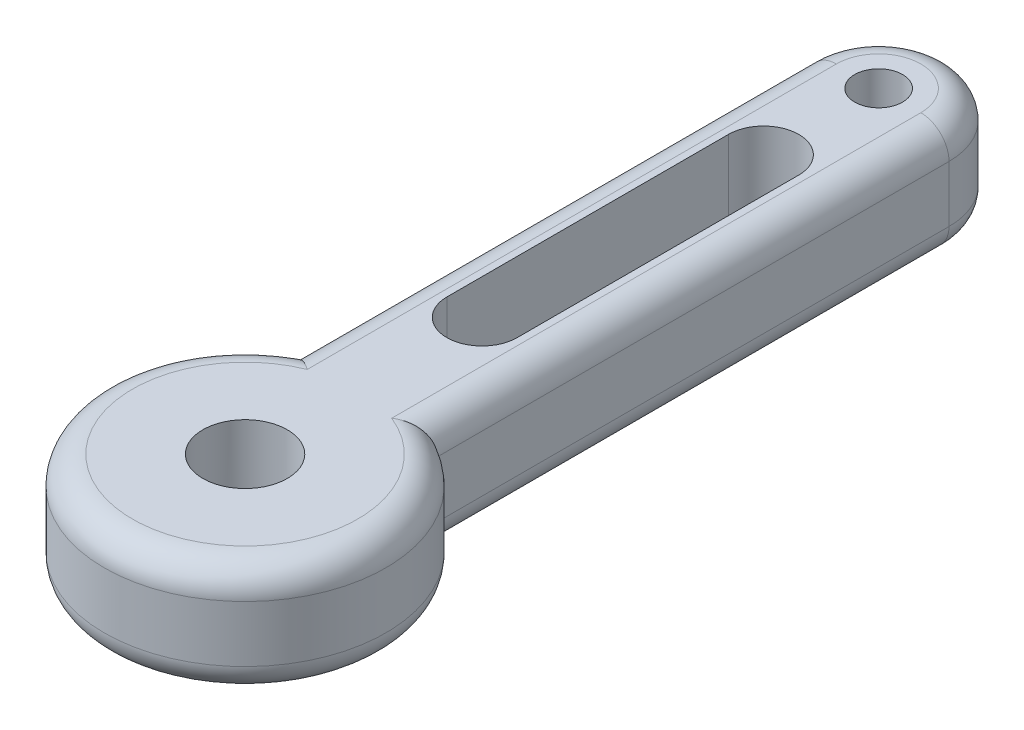
ISO-10303-21;
HEADER;
FILE_DESCRIPTION(('STEP AP214'),'2;1');
FILE_NAME('part.step','',(''),(''),'','','');
FILE_SCHEMA(('AUTOMOTIVE_DESIGN { 1 0 10303 214 1 1 1 1 }'));
ENDSEC;
DATA;
#1=APPLICATION_CONTEXT('core data for automotive mechanical design processes');
#2=APPLICATION_PROTOCOL_DEFINITION('international standard','automotive_design',2000,#1);
#3=PRODUCT_CONTEXT('',#1,'mechanical');
#4=PRODUCT('Part','Part','',(#3));
#5=PRODUCT_RELATED_PRODUCT_CATEGORY('part','',(#4));
#6=PRODUCT_DEFINITION_FORMATION('','',#4);
#7=PRODUCT_DEFINITION_CONTEXT('part definition',#1,'design');
#8=PRODUCT_DEFINITION('design','',#6,#7);
#9=PRODUCT_DEFINITION_SHAPE('','',#8);
#10=(LENGTH_UNIT() NAMED_UNIT(*) SI_UNIT(.MILLI.,.METRE.));
#11=(NAMED_UNIT(*) PLANE_ANGLE_UNIT() SI_UNIT($,.RADIAN.));
#12=(NAMED_UNIT(*) SI_UNIT($,.STERADIAN.) SOLID_ANGLE_UNIT());
#13=UNCERTAINTY_MEASURE_WITH_UNIT(LENGTH_MEASURE(1.E-05),#10,'distance_accuracy_value','');
#14=(GEOMETRIC_REPRESENTATION_CONTEXT(3) GLOBAL_UNCERTAINTY_ASSIGNED_CONTEXT((#13)) GLOBAL_UNIT_ASSIGNED_CONTEXT((#10,
#11,#12)) REPRESENTATION_CONTEXT('',''));
#15=CARTESIAN_POINT('',(0.,0.,0.));
#16=DIRECTION('',(0.,0.,1.));
#17=DIRECTION('',(1.,0.,0.));
#18=AXIS2_PLACEMENT_3D('',#15,#16,#17);
#19=CARTESIAN_POINT('',(0.,0.,0.));
#20=DIRECTION('',(0.,1.,0.));
#21=DIRECTION('',(0.,0.,1.));
#22=AXIS2_PLACEMENT_3D('',#19,#20,#21);
#23=PLANE('',#22);
#24=DIRECTION('',(0.,0.,1.));
#25=VECTOR('',#24,1.);
#26=CARTESIAN_POINT('',(3.,0.,-8.66025403784439));
#27=LINE('',#26,#25);
#28=CARTESIAN_POINT('',(3.,0.,-45.));
#29=VERTEX_POINT('',#28);
#30=CARTESIAN_POINT('',(3.,0.,-7.41619848709566));
#31=VERTEX_POINT('',#30);
#32=EDGE_CURVE('E289',#29,#31,#27,.T.);
#33=ORIENTED_EDGE('',*,*,#32,.T.);
#34=CARTESIAN_POINT('',(0.,0.,0.));
#35=DIRECTION('',(0.,1.,0.));
#36=DIRECTION('',(0.,0.,1.));
#37=AXIS2_PLACEMENT_3D('',#34,#35,#36);
#38=CIRCLE('',#37,8.);
#39=CARTESIAN_POINT('',(-3.,0.,-7.41619848709566));
#40=VERTEX_POINT('',#39);
#41=EDGE_CURVE('E298',#31,#40,#38,.F.);
#42=ORIENTED_EDGE('',*,*,#41,.T.);
#43=DIRECTION('',(0.,0.,1.));
#44=VECTOR('',#43,1.);
#45=CARTESIAN_POINT('',(-3.,0.,0.));
#46=LINE('',#45,#44);
#47=CARTESIAN_POINT('',(-3.,0.,-45.));
#48=VERTEX_POINT('',#47);
#49=EDGE_CURVE('E295',#40,#48,#46,.F.);
#50=ORIENTED_EDGE('',*,*,#49,.T.);
#51=CARTESIAN_POINT('',(0.,0.,-45.));
#52=DIRECTION('',(0.,1.,0.));
#53=DIRECTION('',(0.,0.,1.));
#54=AXIS2_PLACEMENT_3D('',#51,#52,#53);
#55=CIRCLE('',#54,3.);
#56=EDGE_CURVE('E292',#48,#29,#55,.F.);
#57=ORIENTED_EDGE('',*,*,#56,.T.);
#58=EDGE_LOOP('',(#33,#42,#50,#57));
#59=FACE_BOUND('',#58,.T.);
#60=DIRECTION('',(-0.1,0.,0.99498743710662));
#61=VECTOR('',#60,1.);
#62=CARTESIAN_POINT('',(-2.98496231131986,0.,-0.3));
#63=LINE('',#62,#61);
#64=CARTESIAN_POINT('',(-1.98997487421324,0.,-10.2));
#65=VERTEX_POINT('',#64);
#66=CARTESIAN_POINT('',(-2.98496231131986,0.,-0.3));
#67=VERTEX_POINT('',#66);
#68=EDGE_CURVE('E218',#65,#67,#63,.T.);
#69=ORIENTED_EDGE('',*,*,#68,.T.);
#70=CARTESIAN_POINT('',(0.,0.,0.));
#71=DIRECTION('',(0.,1.,0.));
#72=DIRECTION('',(0.,0.,1.));
#73=AXIS2_PLACEMENT_3D('',#70,#71,#72);
#74=CIRCLE('',#73,3.);
#75=CARTESIAN_POINT('',(2.982064694009,0.,-0.327551768038279));
#76=VERTEX_POINT('',#75);
#77=EDGE_CURVE('E255',#76,#67,#74,.F.);
#78=ORIENTED_EDGE('',*,*,#77,.F.);
#79=DIRECTION('',(-0.104593076273157,0.,-0.994515102145622));
#80=VECTOR('',#79,1.);
#81=CARTESIAN_POINT('',(2.98351350266443,0.,-0.313775884019186));
#82=LINE('',#81,#80);
#83=CARTESIAN_POINT('',(1.89873071250755,0.,-10.628348375808));
#84=VERTEX_POINT('',#83);
#85=EDGE_CURVE('E224',#76,#84,#82,.T.);
#86=ORIENTED_EDGE('',*,*,#85,.T.);
#87=CARTESIAN_POINT('',(0.,0.,-10.));
#88=DIRECTION('',(0.,-1.,0.));
#89=DIRECTION('',(0.,0.,-1.));
#90=AXIS2_PLACEMENT_3D('',#87,#88,#89);
#91=CIRCLE('',#90,2.);
#92=EDGE_CURVE('E235',#65,#84,#91,.T.);
#93=ORIENTED_EDGE('',*,*,#92,.F.);
#94=EDGE_LOOP('',(#69,#78,#86,#93));
#95=FACE_BOUND('',#94,.T.);
#96=CARTESIAN_POINT('',(0.,0.,-45.));
#97=DIRECTION('',(0.,1.,0.));
#98=DIRECTION('',(0.,0.,1.));
#99=AXIS2_PLACEMENT_3D('',#96,#97,#98);
#100=CIRCLE('',#99,1.7);
#101=CARTESIAN_POINT('',(0.,0.,-43.3));
#102=VERTEX_POINT('',#101);
#103=EDGE_CURVE('E214',#102,#102,#100,.F.);
#104=ORIENTED_EDGE('',*,*,#103,.F.);
#105=EDGE_LOOP('',(#104));
#106=FACE_BOUND('',#105,.T.);
#107=DIRECTION('',(0.,0.,1.));
#108=VECTOR('',#107,1.);
#109=CARTESIAN_POINT('',(-2.50000000000001,0.,0.));
#110=LINE('',#109,#108);
#111=CARTESIAN_POINT('',(-2.5,0.,-36.8301270189222));
#112=VERTEX_POINT('',#111);
#113=CARTESIAN_POINT('',(-2.5,0.,-16.8301270189222));
#114=VERTEX_POINT('',#113);
#115=EDGE_CURVE('E178',#112,#114,#110,.T.);
#116=ORIENTED_EDGE('',*,*,#115,.T.);
#117=CARTESIAN_POINT('',(0.,0.,-16.8301270189222));
#118=DIRECTION('',(0.,-1.,0.));
#119=DIRECTION('',(0.,0.,-1.));
#120=AXIS2_PLACEMENT_3D('',#117,#118,#119);
#121=CIRCLE('',#120,2.5);
#122=CARTESIAN_POINT('',(2.5,0.,-16.8301270189222));
#123=VERTEX_POINT('',#122);
#124=EDGE_CURVE('E180',#123,#114,#121,.T.);
#125=ORIENTED_EDGE('',*,*,#124,.F.);
#126=DIRECTION('',(0.,0.,1.));
#127=VECTOR('',#126,1.);
#128=CARTESIAN_POINT('',(2.49999999999999,0.,0.));
#129=LINE('',#128,#127);
#130=CARTESIAN_POINT('',(2.5,0.,-36.8301270189222));
#131=VERTEX_POINT('',#130);
#132=EDGE_CURVE('E197',#131,#123,#129,.T.);
#133=ORIENTED_EDGE('',*,*,#132,.F.);
#134=CARTESIAN_POINT('',(0.,0.,-36.8301270189222));
#135=DIRECTION('',(0.,-1.,0.));
#136=DIRECTION('',(0.,0.,-1.));
#137=AXIS2_PLACEMENT_3D('',#134,#135,#136);
#138=CIRCLE('',#137,2.5);
#139=EDGE_CURVE('E189',#112,#131,#138,.T.);
#140=ORIENTED_EDGE('',*,*,#139,.F.);
#141=EDGE_LOOP('',(#116,#125,#133,#140));
#142=FACE_BOUND('',#141,.T.);
#143=ADVANCED_FACE('F42',(#59,#95,#106,#142),#23,.F.);
#144=CARTESIAN_POINT('',(0.,8.,0.));
#145=DIRECTION('',(0.,1.,0.));
#146=DIRECTION('',(0.,0.,1.));
#147=AXIS2_PLACEMENT_3D('',#144,#145,#146);
#148=PLANE('',#147);
#149=DIRECTION('',(0.,0.,1.));
#150=VECTOR('',#149,1.);
#151=CARTESIAN_POINT('',(-3.,8.,-8.66025403784439));
#152=LINE('',#151,#150);
#153=CARTESIAN_POINT('',(-3.,8.,-45.));
#154=VERTEX_POINT('',#153);
#155=CARTESIAN_POINT('',(-3.,8.,-7.41619848709566));
#156=VERTEX_POINT('',#155);
#157=EDGE_CURVE('E320',#154,#156,#152,.T.);
#158=ORIENTED_EDGE('',*,*,#157,.T.);
#159=CARTESIAN_POINT('',(0.,8.,0.));
#160=DIRECTION('',(0.,1.,0.));
#161=DIRECTION('',(0.,0.,1.));
#162=AXIS2_PLACEMENT_3D('',#159,#160,#161);
#163=CIRCLE('',#162,8.);
#164=CARTESIAN_POINT('',(3.,8.,-7.41619848709566));
#165=VERTEX_POINT('',#164);
#166=EDGE_CURVE('E11',#156,#165,#163,.T.);
#167=ORIENTED_EDGE('',*,*,#166,.T.);
#168=DIRECTION('',(0.,0.,1.));
#169=VECTOR('',#168,1.);
#170=CARTESIAN_POINT('',(3.,8.,0.));
#171=LINE('',#170,#169);
#172=CARTESIAN_POINT('',(3.,8.,-45.));
#173=VERTEX_POINT('',#172);
#174=EDGE_CURVE('E52',#165,#173,#171,.F.);
#175=ORIENTED_EDGE('',*,*,#174,.T.);
#176=CARTESIAN_POINT('',(0.,8.,-45.));
#177=DIRECTION('',(0.,1.,0.));
#178=DIRECTION('',(0.,0.,1.));
#179=AXIS2_PLACEMENT_3D('',#176,#177,#178);
#180=CIRCLE('',#179,3.);
#181=EDGE_CURVE('E323',#173,#154,#180,.T.);
#182=ORIENTED_EDGE('',*,*,#181,.T.);
#183=EDGE_LOOP('',(#158,#167,#175,#182));
#184=FACE_BOUND('',#183,.T.);
#185=CARTESIAN_POINT('',(0.,8.,-45.));
#186=DIRECTION('',(0.,1.,0.));
#187=DIRECTION('',(0.,0.,1.));
#188=AXIS2_PLACEMENT_3D('',#185,#186,#187);
#189=CIRCLE('',#188,1.7);
#190=CARTESIAN_POINT('',(0.,8.,-43.3));
#191=VERTEX_POINT('',#190);
#192=EDGE_CURVE('E170',#191,#191,#189,.T.);
#193=ORIENTED_EDGE('',*,*,#192,.F.);
#194=EDGE_LOOP('',(#193));
#195=FACE_BOUND('',#194,.T.);
#196=CARTESIAN_POINT('',(0.,8.,0.));
#197=DIRECTION('',(0.,1.,0.));
#198=DIRECTION('',(0.,0.,1.));
#199=AXIS2_PLACEMENT_3D('',#196,#197,#198);
#200=CIRCLE('',#199,3.);
#201=CARTESIAN_POINT('',(0.,8.,3.));
#202=VERTEX_POINT('',#201);
#203=EDGE_CURVE('E246',#202,#202,#200,.T.);
#204=ORIENTED_EDGE('',*,*,#203,.F.);
#205=EDGE_LOOP('',(#204));
#206=FACE_BOUND('',#205,.T.);
#207=CARTESIAN_POINT('',(0.,8.,-16.8301270189222));
#208=DIRECTION('',(0.,1.,0.));
#209=DIRECTION('',(0.,0.,1.));
#210=AXIS2_PLACEMENT_3D('',#207,#208,#209);
#211=CIRCLE('',#210,2.5);
#212=CARTESIAN_POINT('',(2.5,8.,-16.8301270189222));
#213=VERTEX_POINT('',#212);
#214=CARTESIAN_POINT('',(-2.5,8.,-16.8301270189222));
#215=VERTEX_POINT('',#214);
#216=EDGE_CURVE('E184',#213,#215,#211,.F.);
#217=ORIENTED_EDGE('',*,*,#216,.T.);
#218=DIRECTION('',(0.,0.,1.));
#219=VECTOR('',#218,1.);
#220=CARTESIAN_POINT('',(-2.50000000000001,8.,0.));
#221=LINE('',#220,#219);
#222=CARTESIAN_POINT('',(-2.5,8.,-36.8301270189222));
#223=VERTEX_POINT('',#222);
#224=EDGE_CURVE('E175',#223,#215,#221,.T.);
#225=ORIENTED_EDGE('',*,*,#224,.F.);
#226=CARTESIAN_POINT('',(0.,8.,-36.8301270189222));
#227=DIRECTION('',(0.,1.,0.));
#228=DIRECTION('',(0.,0.,1.));
#229=AXIS2_PLACEMENT_3D('',#226,#227,#228);
#230=CIRCLE('',#229,2.5);
#231=CARTESIAN_POINT('',(2.5,8.,-36.8301270189222));
#232=VERTEX_POINT('',#231);
#233=EDGE_CURVE('E158',#223,#232,#230,.F.);
#234=ORIENTED_EDGE('',*,*,#233,.T.);
#235=DIRECTION('',(0.,0.,1.));
#236=VECTOR('',#235,1.);
#237=CARTESIAN_POINT('',(2.49999999999999,8.,0.));
#238=LINE('',#237,#236);
#239=EDGE_CURVE('E191',#232,#213,#238,.T.);
#240=ORIENTED_EDGE('',*,*,#239,.T.);
#241=EDGE_LOOP('',(#217,#225,#234,#240));
#242=FACE_BOUND('',#241,.T.);
#243=ADVANCED_FACE('F183',(#184,#195,#206,#242),#148,.T.);
#244=CARTESIAN_POINT('',(0.,-0.000999999999999265,0.));
#245=DIRECTION('',(0.,1.,0.));
#246=DIRECTION('',(0.,0.,1.));
#247=AXIS2_PLACEMENT_3D('',#244,#245,#246);
#248=CYLINDRICAL_SURFACE('',#247,3.);
#249=ORIENTED_EDGE('',*,*,#77,.T.);
#250=DIRECTION('',(0.,-1.,0.));
#251=VECTOR('',#250,1.);
#252=CARTESIAN_POINT('',(-2.98496231131986,3.,-0.3));
#253=LINE('',#252,#251);
#254=CARTESIAN_POINT('',(-2.98496231131986,3.,-0.3));
#255=VERTEX_POINT('',#254);
#256=EDGE_CURVE('E242',#255,#67,#253,.T.);
#257=ORIENTED_EDGE('',*,*,#256,.F.);
#258=CARTESIAN_POINT('',(0.,3.,0.));
#259=DIRECTION('',(0.,-1.,0.));
#260=DIRECTION('',(0.,0.,-1.));
#261=AXIS2_PLACEMENT_3D('',#258,#259,#260);
#262=CIRCLE('',#261,3.);
#263=CARTESIAN_POINT('',(2.982064694009,3.,-0.327551768038279));
#264=VERTEX_POINT('',#263);
#265=EDGE_CURVE('E274',#264,#255,#262,.F.);
#266=ORIENTED_EDGE('',*,*,#265,.F.);
#267=DIRECTION('',(0.,1.,0.));
#268=VECTOR('',#267,1.);
#269=CARTESIAN_POINT('',(2.98206469400897,-0.000999999999999265,-0.327551768038583));
#270=LINE('',#269,#268);
#271=EDGE_CURVE('E277',#76,#264,#270,.T.);
#272=ORIENTED_EDGE('',*,*,#271,.F.);
#273=EDGE_LOOP('',(#249,#257,#266,#272));
#274=FACE_BOUND('',#273,.T.);
#275=ORIENTED_EDGE('',*,*,#203,.T.);
#276=EDGE_LOOP('',(#275));
#277=FACE_BOUND('',#276,.T.);
#278=ADVANCED_FACE('F399',(#274,#277),#248,.F.);
#279=CARTESIAN_POINT('',(5.,8.,0.));
#280=DIRECTION('',(1.,0.,0.));
#281=DIRECTION('',(0.,0.,-1.));
#282=AXIS2_PLACEMENT_3D('',#279,#280,#281);
#283=PLANE('',#282);
#284=DIRECTION('',(0.,-1.,0.));
#285=VECTOR('',#284,1.);
#286=CARTESIAN_POINT('',(5.,8.,-8.66025403784439));
#287=LINE('',#286,#285);
#288=CARTESIAN_POINT('',(5.,6.,-8.66025403784439));
#289=VERTEX_POINT('',#288);
#290=CARTESIAN_POINT('',(5.,2.,-8.66025403784439));
#291=VERTEX_POINT('',#290);
#292=EDGE_CURVE('E258',#289,#291,#287,.T.);
#293=ORIENTED_EDGE('',*,*,#292,.T.);
#294=DIRECTION('',(0.,0.,1.));
#295=VECTOR('',#294,1.);
#296=CARTESIAN_POINT('',(5.,2.,-45.));
#297=LINE('',#296,#295);
#298=CARTESIAN_POINT('',(5.,2.,-45.));
#299=VERTEX_POINT('',#298);
#300=EDGE_CURVE('E317',#291,#299,#297,.F.);
#301=ORIENTED_EDGE('',*,*,#300,.T.);
#302=DIRECTION('',(0.,-1.,0.));
#303=VECTOR('',#302,1.);
#304=CARTESIAN_POINT('',(5.,8.,-45.));
#305=LINE('',#304,#303);
#306=CARTESIAN_POINT('',(5.,6.,-45.));
#307=VERTEX_POINT('',#306);
#308=EDGE_CURVE('E270',#307,#299,#305,.T.);
#309=ORIENTED_EDGE('',*,*,#308,.F.);
#310=DIRECTION('',(0.,0.,1.));
#311=VECTOR('',#310,1.);
#312=CARTESIAN_POINT('',(5.,6.,0.));
#313=LINE('',#312,#311);
#314=EDGE_CURVE('E314',#307,#289,#313,.T.);
#315=ORIENTED_EDGE('',*,*,#314,.T.);
#316=EDGE_LOOP('',(#293,#301,#309,#315));
#317=FACE_BOUND('',#316,.T.);
#318=ADVANCED_FACE('F415',(#317),#283,.T.);
#319=CARTESIAN_POINT('',(0.,8.,-45.));
#320=DIRECTION('',(0.,-1.,0.));
#321=DIRECTION('',(0.,0.,-1.));
#322=AXIS2_PLACEMENT_3D('',#319,#320,#321);
#323=CYLINDRICAL_SURFACE('',#322,5.);
#324=ORIENTED_EDGE('',*,*,#308,.T.);
#325=CARTESIAN_POINT('',(0.,2.,-45.));
#326=DIRECTION('',(0.,1.,0.));
#327=DIRECTION('',(0.,0.,1.));
#328=AXIS2_PLACEMENT_3D('',#325,#326,#327);
#329=CIRCLE('',#328,5.);
#330=CARTESIAN_POINT('',(-5.,2.,-45.));
#331=VERTEX_POINT('',#330);
#332=EDGE_CURVE('E311',#299,#331,#329,.T.);
#333=ORIENTED_EDGE('',*,*,#332,.T.);
#334=DIRECTION('',(0.,-1.,0.));
#335=VECTOR('',#334,1.);
#336=CARTESIAN_POINT('',(-5.,8.,-45.));
#337=LINE('',#336,#335);
#338=CARTESIAN_POINT('',(-5.,6.,-45.));
#339=VERTEX_POINT('',#338);
#340=EDGE_CURVE('E266',#339,#331,#337,.T.);
#341=ORIENTED_EDGE('',*,*,#340,.F.);
#342=CARTESIAN_POINT('',(0.,6.,-45.));
#343=DIRECTION('',(0.,1.,0.));
#344=DIRECTION('',(0.,0.,1.));
#345=AXIS2_PLACEMENT_3D('',#342,#343,#344);
#346=CIRCLE('',#345,5.);
#347=EDGE_CURVE('E308',#339,#307,#346,.F.);
#348=ORIENTED_EDGE('',*,*,#347,.T.);
#349=EDGE_LOOP('',(#324,#333,#341,#348));
#350=FACE_BOUND('',#349,.T.);
#351=ADVANCED_FACE('F412',(#350),#323,.T.);
#352=CARTESIAN_POINT('',(-5.,8.,0.));
#353=DIRECTION('',(1.,0.,0.));
#354=DIRECTION('',(0.,0.,-1.));
#355=AXIS2_PLACEMENT_3D('',#352,#353,#354);
#356=PLANE('',#355);
#357=ORIENTED_EDGE('',*,*,#340,.T.);
#358=DIRECTION('',(0.,0.,1.));
#359=VECTOR('',#358,1.);
#360=CARTESIAN_POINT('',(-5.,2.,0.));
#361=LINE('',#360,#359);
#362=CARTESIAN_POINT('',(-5.,2.,-8.66025403784439));
#363=VERTEX_POINT('',#362);
#364=EDGE_CURVE('E305',#331,#363,#361,.T.);
#365=ORIENTED_EDGE('',*,*,#364,.T.);
#366=DIRECTION('',(0.,-1.,0.));
#367=VECTOR('',#366,1.);
#368=CARTESIAN_POINT('',(-5.,8.,-8.66025403784439));
#369=LINE('',#368,#367);
#370=CARTESIAN_POINT('',(-5.,6.,-8.66025403784439));
#371=VERTEX_POINT('',#370);
#372=EDGE_CURVE('E262',#371,#363,#369,.T.);
#373=ORIENTED_EDGE('',*,*,#372,.F.);
#374=DIRECTION('',(0.,0.,1.));
#375=VECTOR('',#374,1.);
#376=CARTESIAN_POINT('',(-5.,6.,-45.));
#377=LINE('',#376,#375);
#378=EDGE_CURVE('E302',#371,#339,#377,.F.);
#379=ORIENTED_EDGE('',*,*,#378,.T.);
#380=EDGE_LOOP('',(#357,#365,#373,#379));
#381=FACE_BOUND('',#380,.T.);
#382=ADVANCED_FACE('F408',(#381),#356,.F.);
#383=CARTESIAN_POINT('',(0.,8.,0.));
#384=DIRECTION('',(0.,-1.,0.));
#385=DIRECTION('',(0.,0.,-1.));
#386=AXIS2_PLACEMENT_3D('',#383,#384,#385);
#387=CYLINDRICAL_SURFACE('',#386,10.);
#388=ORIENTED_EDGE('',*,*,#372,.T.);
#389=CARTESIAN_POINT('',(0.,2.,0.));
#390=DIRECTION('',(0.,1.,0.));
#391=DIRECTION('',(0.,0.,1.));
#392=AXIS2_PLACEMENT_3D('',#389,#390,#391);
#393=CIRCLE('',#392,10.);
#394=EDGE_CURVE('E285',#363,#291,#393,.T.);
#395=ORIENTED_EDGE('',*,*,#394,.T.);
#396=ORIENTED_EDGE('',*,*,#292,.F.);
#397=CARTESIAN_POINT('',(0.,6.,0.));
#398=DIRECTION('',(0.,1.,0.));
#399=DIRECTION('',(0.,0.,1.));
#400=AXIS2_PLACEMENT_3D('',#397,#398,#399);
#401=CIRCLE('',#400,10.);
#402=EDGE_CURVE('E281',#289,#371,#401,.F.);
#403=ORIENTED_EDGE('',*,*,#402,.T.);
#404=EDGE_LOOP('',(#388,#395,#396,#403));
#405=FACE_BOUND('',#404,.T.);
#406=ADVANCED_FACE('F404',(#405),#387,.T.);
#407=CARTESIAN_POINT('',(2.98351350266443,3.,-0.313775884019186));
#408=DIRECTION('',(-0.994515102145622,0.,0.104593076273157));
#409=DIRECTION('',(0.104593076273157,0.,0.994515102145622));
#410=AXIS2_PLACEMENT_3D('',#407,#408,#409);
#411=PLANE('',#410);
#412=ORIENTED_EDGE('',*,*,#271,.T.);
#413=DIRECTION('',(-0.104593076273157,0.,-0.994515102145622));
#414=VECTOR('',#413,1.);
#415=CARTESIAN_POINT('',(2.98351350266443,3.,-0.313775884019186));
#416=LINE('',#415,#414);
#417=CARTESIAN_POINT('',(1.89873071250755,3.,-10.628348375808));
#418=VERTEX_POINT('',#417);
#419=EDGE_CURVE('E228',#264,#418,#416,.T.);
#420=ORIENTED_EDGE('',*,*,#419,.T.);
#421=DIRECTION('',(0.,-1.,0.));
#422=VECTOR('',#421,1.);
#423=CARTESIAN_POINT('',(1.89873071250755,3.,-10.628348375808));
#424=LINE('',#423,#422);
#425=EDGE_CURVE('E247',#418,#84,#424,.T.);
#426=ORIENTED_EDGE('',*,*,#425,.T.);
#427=ORIENTED_EDGE('',*,*,#85,.F.);
#428=EDGE_LOOP('',(#412,#420,#426,#427));
#429=FACE_BOUND('',#428,.T.);
#430=ADVANCED_FACE('F407',(#429),#411,.T.);
#431=CARTESIAN_POINT('',(0.,3.,0.));
#432=DIRECTION('',(0.,-1.,0.));
#433=DIRECTION('',(0.,0.,-1.));
#434=AXIS2_PLACEMENT_3D('',#431,#432,#433);
#435=PLANE('',#434);
#436=ORIENTED_EDGE('',*,*,#265,.T.);
#437=DIRECTION('',(-0.1,0.,0.99498743710662));
#438=VECTOR('',#437,1.);
#439=CARTESIAN_POINT('',(-2.98496231131986,3.,-0.3));
#440=LINE('',#439,#438);
#441=CARTESIAN_POINT('',(-1.98997487421324,3.,-10.2));
#442=VERTEX_POINT('',#441);
#443=EDGE_CURVE('E219',#442,#255,#440,.T.);
#444=ORIENTED_EDGE('',*,*,#443,.F.);
#445=CARTESIAN_POINT('',(0.,3.,-10.));
#446=DIRECTION('',(0.,-1.,0.));
#447=DIRECTION('',(0.,0.,-1.));
#448=AXIS2_PLACEMENT_3D('',#445,#446,#447);
#449=CIRCLE('',#448,2.);
#450=EDGE_CURVE('E223',#442,#418,#449,.T.);
#451=ORIENTED_EDGE('',*,*,#450,.T.);
#452=ORIENTED_EDGE('',*,*,#419,.F.);
#453=EDGE_LOOP('',(#436,#444,#451,#452));
#454=FACE_BOUND('',#453,.T.);
#455=ADVANCED_FACE('F473',(#454),#435,.T.);
#456=CARTESIAN_POINT('',(-2.98496231131986,3.,-0.3));
#457=DIRECTION('',(0.99498743710662,0.,0.1));
#458=DIRECTION('',(0.1,0.,-0.99498743710662));
#459=AXIS2_PLACEMENT_3D('',#456,#457,#458);
#460=PLANE('',#459);
#461=ORIENTED_EDGE('',*,*,#68,.F.);
#462=DIRECTION('',(0.,-1.,0.));
#463=VECTOR('',#462,1.);
#464=CARTESIAN_POINT('',(-1.98997487421324,3.,-10.2));
#465=LINE('',#464,#463);
#466=EDGE_CURVE('E231',#442,#65,#465,.T.);
#467=ORIENTED_EDGE('',*,*,#466,.F.);
#468=ORIENTED_EDGE('',*,*,#443,.T.);
#469=ORIENTED_EDGE('',*,*,#256,.T.);
#470=EDGE_LOOP('',(#461,#467,#468,#469));
#471=FACE_BOUND('',#470,.T.);
#472=ADVANCED_FACE('F476',(#471),#460,.T.);
#473=CARTESIAN_POINT('',(0.,3.,-10.));
#474=DIRECTION('',(0.,-1.,0.));
#475=DIRECTION('',(0.,0.,-1.));
#476=AXIS2_PLACEMENT_3D('',#473,#474,#475);
#477=CYLINDRICAL_SURFACE('',#476,2.);
#478=ORIENTED_EDGE('',*,*,#92,.T.);
#479=ORIENTED_EDGE('',*,*,#425,.F.);
#480=ORIENTED_EDGE('',*,*,#450,.F.);
#481=ORIENTED_EDGE('',*,*,#466,.T.);
#482=EDGE_LOOP('',(#478,#479,#480,#481));
#483=FACE_BOUND('',#482,.T.);
#484=ADVANCED_FACE('F471',(#483),#477,.F.);
#485=CARTESIAN_POINT('',(0.,-0.000999999999999265,-45.));
#486=DIRECTION('',(0.,1.,0.));
#487=DIRECTION('',(0.,0.,1.));
#488=AXIS2_PLACEMENT_3D('',#485,#486,#487);
#489=CYLINDRICAL_SURFACE('',#488,1.7);
#490=ORIENTED_EDGE('',*,*,#192,.T.);
#491=EDGE_LOOP('',(#490));
#492=FACE_BOUND('',#491,.T.);
#493=ORIENTED_EDGE('',*,*,#103,.T.);
#494=EDGE_LOOP('',(#493));
#495=FACE_BOUND('',#494,.T.);
#496=ADVANCED_FACE('F464',(#492,#495),#489,.F.);
#497=CARTESIAN_POINT('',(-2.50000000000001,8.001,0.));
#498=DIRECTION('',(1.,0.,0.));
#499=DIRECTION('',(0.,0.,-1.));
#500=AXIS2_PLACEMENT_3D('',#497,#498,#499);
#501=PLANE('',#500);
#502=ORIENTED_EDGE('',*,*,#224,.T.);
#503=DIRECTION('',(0.,-1.,0.));
#504=VECTOR('',#503,1.);
#505=CARTESIAN_POINT('',(-2.5,8.001,-16.8301270189222));
#506=LINE('',#505,#504);
#507=EDGE_CURVE('E171',#215,#114,#506,.T.);
#508=ORIENTED_EDGE('',*,*,#507,.T.);
#509=ORIENTED_EDGE('',*,*,#115,.F.);
#510=DIRECTION('',(0.,-1.,0.));
#511=VECTOR('',#510,1.);
#512=CARTESIAN_POINT('',(-2.5,8.001,-36.8301270189222));
#513=LINE('',#512,#511);
#514=EDGE_CURVE('E162',#223,#112,#513,.T.);
#515=ORIENTED_EDGE('',*,*,#514,.F.);
#516=EDGE_LOOP('',(#502,#508,#509,#515));
#517=FACE_BOUND('',#516,.T.);
#518=ADVANCED_FACE('F174',(#517),#501,.T.);
#519=CARTESIAN_POINT('',(0.,8.001,-16.8301270189222));
#520=DIRECTION('',(0.,-1.,0.));
#521=DIRECTION('',(0.,0.,-1.));
#522=AXIS2_PLACEMENT_3D('',#519,#520,#521);
#523=CYLINDRICAL_SURFACE('',#522,2.5);
#524=DIRECTION('',(0.,-1.,0.));
#525=VECTOR('',#524,1.);
#526=CARTESIAN_POINT('',(2.5,8.001,-16.8301270189222));
#527=LINE('',#526,#525);
#528=EDGE_CURVE('E206',#213,#123,#527,.T.);
#529=ORIENTED_EDGE('',*,*,#528,.T.);
#530=ORIENTED_EDGE('',*,*,#124,.T.);
#531=ORIENTED_EDGE('',*,*,#507,.F.);
#532=ORIENTED_EDGE('',*,*,#216,.F.);
#533=EDGE_LOOP('',(#529,#530,#531,#532));
#534=FACE_BOUND('',#533,.T.);
#535=ADVANCED_FACE('F455',(#534),#523,.F.);
#536=CARTESIAN_POINT('',(2.49999999999999,8.001,0.));
#537=DIRECTION('',(1.,0.,0.));
#538=DIRECTION('',(0.,0.,-1.));
#539=AXIS2_PLACEMENT_3D('',#536,#537,#538);
#540=PLANE('',#539);
#541=DIRECTION('',(0.,-1.,0.));
#542=VECTOR('',#541,1.);
#543=CARTESIAN_POINT('',(2.5,8.001,-36.8301270189222));
#544=LINE('',#543,#542);
#545=EDGE_CURVE('E164',#232,#131,#544,.T.);
#546=ORIENTED_EDGE('',*,*,#545,.T.);
#547=ORIENTED_EDGE('',*,*,#132,.T.);
#548=ORIENTED_EDGE('',*,*,#528,.F.);
#549=ORIENTED_EDGE('',*,*,#239,.F.);
#550=EDGE_LOOP('',(#546,#547,#548,#549));
#551=FACE_BOUND('',#550,.T.);
#552=ADVANCED_FACE('F451',(#551),#540,.F.);
#553=CARTESIAN_POINT('',(0.,8.001,-36.8301270189222));
#554=DIRECTION('',(0.,-1.,0.));
#555=DIRECTION('',(0.,0.,-1.));
#556=AXIS2_PLACEMENT_3D('',#553,#554,#555);
#557=CYLINDRICAL_SURFACE('',#556,2.5);
#558=ORIENTED_EDGE('',*,*,#514,.T.);
#559=ORIENTED_EDGE('',*,*,#139,.T.);
#560=ORIENTED_EDGE('',*,*,#545,.F.);
#561=ORIENTED_EDGE('',*,*,#233,.F.);
#562=EDGE_LOOP('',(#558,#559,#560,#561));
#563=FACE_BOUND('',#562,.T.);
#564=ADVANCED_FACE('F160',(#563),#557,.F.);
#565=CARTESIAN_POINT('',(0.,2.,-45.));
#566=DIRECTION('',(0.,1.,0.));
#567=DIRECTION('',(0.,0.,1.));
#568=AXIS2_PLACEMENT_3D('',#565,#566,#567);
#569=TOROIDAL_SURFACE('',#568,3.,2.);
#570=CARTESIAN_POINT('',(3.,2.,-45.));
#571=DIRECTION('',(0.,0.,1.));
#572=DIRECTION('',(1.,0.,0.));
#573=AXIS2_PLACEMENT_3D('',#570,#571,#572);
#574=CIRCLE('',#573,2.);
#575=EDGE_CURVE('E444',#29,#299,#574,.T.);
#576=ORIENTED_EDGE('',*,*,#575,.F.);
#577=ORIENTED_EDGE('',*,*,#56,.F.);
#578=CARTESIAN_POINT('',(-3.,2.,-45.));
#579=DIRECTION('',(0.,0.,1.));
#580=DIRECTION('',(1.,0.,0.));
#581=AXIS2_PLACEMENT_3D('',#578,#579,#580);
#582=CIRCLE('',#581,2.);
#583=EDGE_CURVE('E377',#331,#48,#582,.T.);
#584=ORIENTED_EDGE('',*,*,#583,.F.);
#585=ORIENTED_EDGE('',*,*,#332,.F.);
#586=EDGE_LOOP('',(#576,#577,#584,#585));
#587=FACE_BOUND('',#586,.T.);
#588=ADVANCED_FACE('F355',(#587),#569,.T.);
#589=CARTESIAN_POINT('',(-3.,2.,0.));
#590=DIRECTION('',(0.,0.,1.));
#591=DIRECTION('',(1.,0.,0.));
#592=AXIS2_PLACEMENT_3D('',#589,#590,#591);
#593=CYLINDRICAL_SURFACE('',#592,2.);
#594=ORIENTED_EDGE('',*,*,#583,.T.);
#595=ORIENTED_EDGE('',*,*,#49,.F.);
#596=CARTESIAN_POINT('',(-5.,2.,-8.66025403784439));
#597=CARTESIAN_POINT('',(-5.00000857828605,1.9493033876818,-8.66025809940055));
#598=CARTESIAN_POINT('',(-4.99807260439549,1.89861143874987,-8.65914123338117));
#599=CARTESIAN_POINT('',(-4.99037714359612,1.79763107015685,-8.65469701706698));
#600=CARTESIAN_POINT('',(-4.98461881440431,1.7473425329764,-8.65137033608188));
#601=CARTESIAN_POINT('',(-4.96937458140785,1.64773081318408,-8.64255541618371));
#602=CARTESIAN_POINT('',(-4.95990361625807,1.59840458330099,-8.63707583974778));
#603=CARTESIAN_POINT('',(-4.93736538754226,1.50087664132802,-8.62401856578884));
#604=CARTESIAN_POINT('',(-4.92429799162599,1.45267497069326,-8.61644079105113));
#605=CARTESIAN_POINT('',(-4.8799465842752,1.31032940383222,-8.5906789200359));
#606=CARTESIAN_POINT('',(-4.84348726228278,1.21827829465239,-8.56945128769585));
#607=CARTESIAN_POINT('',(-4.75843488092064,1.0421364344717,-8.51968101498686));
#608=CARTESIAN_POINT('',(-4.7098328833025,0.958051610634122,-8.49113298564885));
#609=CARTESIAN_POINT('',(-4.5998624327042,0.795632094079099,-8.42613358827095));
#610=CARTESIAN_POINT('',(-4.53799850237471,0.717758110289207,-8.38937203274734));
#611=CARTESIAN_POINT('',(-4.40532293017597,0.573578206182028,-8.30992222342923));
#612=CARTESIAN_POINT('',(-4.3345092940803,0.507274871969088,-8.26723264850837));
#613=CARTESIAN_POINT('',(-4.17674899547396,0.379250523859101,-8.17129516027823));
#614=CARTESIAN_POINT('',(-4.08889246698229,0.319142289863884,-8.11739450235379));
#615=CARTESIAN_POINT('',(-3.90718309724362,0.214493277397185,-8.00468697915293));
#616=CARTESIAN_POINT('',(-3.81332338432946,0.169970730705519,-7.94587446700476));
#617=CARTESIAN_POINT('',(-3.60218143806357,0.0887998490412005,-7.81198868799627));
#618=CARTESIAN_POINT('',(-3.4840749787925,0.0556933797644309,-7.73607078147067));
#619=CARTESIAN_POINT('',(-3.24628816038372,0.011550619294969,-7.58082390379345));
#620=CARTESIAN_POINT('',(-3.1266111639009,0.000473102362649999,-7.50150158864297));
#621=CARTESIAN_POINT('',(-3.00513524395049,4.93805669828304E-06,-7.41966006674631));
#622=CARTESIAN_POINT('',(-3.00256743417533,-5.98682235877376E-09,-7.41792945598608));
#623=CARTESIAN_POINT('',(-3.,0.,-7.41619848709566));
#624=B_SPLINE_CURVE_WITH_KNOTS('',3,(#596,#597,#598,#599,#600,#601,#602,#603,#604,#605,#606,
#607,#608,#609,#610,#611,#612,#613,#614,#615,#616,#617,#618,#619,#620,#621,#622,#623),
.UNSPECIFIED.,.F.,.F.,(4,2,2,2,2,2,2,2,2,2,2,2,2,4),(0.,0.152032753048417,0.30401947933425,
0.455400827450668,0.606787747212896,0.909060013550453,1.21155544208785,1.52837226773112,
1.84525981325291,2.20181817883787,2.55879225529753,2.98971636370608,3.41983326412028,
3.42912292529623),.UNSPECIFIED.);
#625=EDGE_CURVE('E337',#363,#40,#624,.T.);
#626=ORIENTED_EDGE('',*,*,#625,.F.);
#627=ORIENTED_EDGE('',*,*,#364,.F.);
#628=EDGE_LOOP('',(#594,#595,#626,#627));
#629=FACE_BOUND('',#628,.T.);
#630=ADVANCED_FACE('F350',(#629),#593,.T.);
#631=CARTESIAN_POINT('',(3.,2.,0.));
#632=DIRECTION('',(0.,0.,-1.));
#633=DIRECTION('',(-1.,0.,0.));
#634=AXIS2_PLACEMENT_3D('',#631,#632,#633);
#635=CYLINDRICAL_SURFACE('',#634,2.);
#636=ORIENTED_EDGE('',*,*,#575,.T.);
#637=ORIENTED_EDGE('',*,*,#300,.F.);
#638=CARTESIAN_POINT('',(5.,2.,-8.66025403784439));
#639=CARTESIAN_POINT('',(5.00000857828605,1.9493033876818,-8.66025809940055));
#640=CARTESIAN_POINT('',(4.99807260439549,1.89861143874987,-8.65914123338117));
#641=CARTESIAN_POINT('',(4.99037714359612,1.79763107015685,-8.65469701706698));
#642=CARTESIAN_POINT('',(4.98461881440431,1.7473425329764,-8.65137033608188));
#643=CARTESIAN_POINT('',(4.96937458140785,1.64773081318408,-8.64255541618371));
#644=CARTESIAN_POINT('',(4.95990361625807,1.59840458330099,-8.63707583974778));
#645=CARTESIAN_POINT('',(4.93736538754226,1.50087664132802,-8.62401856578884));
#646=CARTESIAN_POINT('',(4.92429799162599,1.45267497069326,-8.61644079105113));
#647=CARTESIAN_POINT('',(4.8799465842752,1.31032940383222,-8.5906789200359));
#648=CARTESIAN_POINT('',(4.84348726228278,1.21827829465239,-8.56945128769585));
#649=CARTESIAN_POINT('',(4.75843488092064,1.0421364344717,-8.51968101498686));
#650=CARTESIAN_POINT('',(4.7098328833025,0.958051610634122,-8.49113298564885));
#651=CARTESIAN_POINT('',(4.5998624327042,0.795632094079099,-8.42613358827095));
#652=CARTESIAN_POINT('',(4.53799850237471,0.717758110289207,-8.38937203274734));
#653=CARTESIAN_POINT('',(4.40532293017597,0.573578206182028,-8.30992222342923));
#654=CARTESIAN_POINT('',(4.3345092940803,0.507274871969088,-8.26723264850837));
#655=CARTESIAN_POINT('',(4.17674899547396,0.379250523859101,-8.17129516027823));
#656=CARTESIAN_POINT('',(4.08889246698229,0.319142289863884,-8.11739450235379));
#657=CARTESIAN_POINT('',(3.90718309724362,0.214493277397185,-8.00468697915293));
#658=CARTESIAN_POINT('',(3.81332338432946,0.169970730705519,-7.94587446700476));
#659=CARTESIAN_POINT('',(3.60218143806357,0.0887998490412005,-7.81198868799627));
#660=CARTESIAN_POINT('',(3.4840749787925,0.0556933797644309,-7.73607078147067));
#661=CARTESIAN_POINT('',(3.24628816038372,0.011550619294969,-7.58082390379345));
#662=CARTESIAN_POINT('',(3.1266111639009,0.000473102362649999,-7.50150158864297));
#663=CARTESIAN_POINT('',(3.00513524395049,4.93805669828304E-06,-7.41966006674631));
#664=CARTESIAN_POINT('',(3.00256743417533,-5.98682235877376E-09,-7.41792945598608));
#665=CARTESIAN_POINT('',(3.,0.,-7.41619848709566));
#666=B_SPLINE_CURVE_WITH_KNOTS('',3,(#638,#639,#640,#641,#642,#643,#644,#645,#646,#647,#648,
#649,#650,#651,#652,#653,#654,#655,#656,#657,#658,#659,#660,#661,#662,#663,#664,#665),
.UNSPECIFIED.,.F.,.F.,(4,2,2,2,2,2,2,2,2,2,2,2,2,4),(0.,0.152032753048417,0.30401947933425,
0.455400827450668,0.606787747212896,0.909060013550453,1.21155544208785,1.52837226773112,
1.84525981325291,2.20181817883787,2.55879225529753,2.98971636370608,3.41983326412028,
3.42912292529623),.UNSPECIFIED.);
#667=EDGE_CURVE('E328',#31,#291,#666,.F.);
#668=ORIENTED_EDGE('',*,*,#667,.F.);
#669=ORIENTED_EDGE('',*,*,#32,.F.);
#670=EDGE_LOOP('',(#636,#637,#668,#669));
#671=FACE_BOUND('',#670,.T.);
#672=ADVANCED_FACE('F347',(#671),#635,.T.);
#673=CARTESIAN_POINT('',(0.,2.,0.));
#674=DIRECTION('',(0.,1.,0.));
#675=DIRECTION('',(0.,0.,1.));
#676=AXIS2_PLACEMENT_3D('',#673,#674,#675);
#677=TOROIDAL_SURFACE('',#676,8.,2.);
#678=ORIENTED_EDGE('',*,*,#625,.T.);
#679=ORIENTED_EDGE('',*,*,#41,.F.);
#680=ORIENTED_EDGE('',*,*,#667,.T.);
#681=ORIENTED_EDGE('',*,*,#394,.F.);
#682=EDGE_LOOP('',(#678,#679,#680,#681));
#683=FACE_BOUND('',#682,.T.);
#684=ADVANCED_FACE('F344',(#683),#677,.T.);
#685=CARTESIAN_POINT('',(0.,6.,-45.));
#686=DIRECTION('',(0.,1.,0.));
#687=DIRECTION('',(0.,0.,1.));
#688=AXIS2_PLACEMENT_3D('',#685,#686,#687);
#689=TOROIDAL_SURFACE('',#688,3.,2.);
#690=CARTESIAN_POINT('',(3.,6.,-45.));
#691=DIRECTION('',(0.,0.,1.));
#692=DIRECTION('',(1.,0.,0.));
#693=AXIS2_PLACEMENT_3D('',#690,#691,#692);
#694=CIRCLE('',#693,2.);
#695=EDGE_CURVE('E383',#307,#173,#694,.T.);
#696=ORIENTED_EDGE('',*,*,#695,.F.);
#697=ORIENTED_EDGE('',*,*,#347,.F.);
#698=CARTESIAN_POINT('',(-3.,6.,-45.));
#699=DIRECTION('',(0.,0.,1.));
#700=DIRECTION('',(1.,0.,0.));
#701=AXIS2_PLACEMENT_3D('',#698,#699,#700);
#702=CIRCLE('',#701,2.);
#703=EDGE_CURVE('E46',#154,#339,#702,.T.);
#704=ORIENTED_EDGE('',*,*,#703,.F.);
#705=ORIENTED_EDGE('',*,*,#181,.F.);
#706=EDGE_LOOP('',(#696,#697,#704,#705));
#707=FACE_BOUND('',#706,.T.);
#708=ADVANCED_FACE('F44',(#707),#689,.T.);
#709=CARTESIAN_POINT('',(-3.,6.,0.));
#710=DIRECTION('',(0.,0.,-1.));
#711=DIRECTION('',(-1.,0.,0.));
#712=AXIS2_PLACEMENT_3D('',#709,#710,#711);
#713=CYLINDRICAL_SURFACE('',#712,2.);
#714=ORIENTED_EDGE('',*,*,#703,.T.);
#715=ORIENTED_EDGE('',*,*,#378,.F.);
#716=CARTESIAN_POINT('',(-5.,6.,-8.66025403784439));
#717=CARTESIAN_POINT('',(-5.00000857828605,6.0506966123182,-8.66025809940055));
#718=CARTESIAN_POINT('',(-4.99807260439549,6.10138856125013,-8.65914123338117));
#719=CARTESIAN_POINT('',(-4.99037714359612,6.20236892984315,-8.65469701706698));
#720=CARTESIAN_POINT('',(-4.98461881440431,6.2526574670236,-8.65137033608188));
#721=CARTESIAN_POINT('',(-4.96937458140785,6.35226918681592,-8.64255541618371));
#722=CARTESIAN_POINT('',(-4.95990361625807,6.40159541669901,-8.63707583974778));
#723=CARTESIAN_POINT('',(-4.93736538754226,6.49912335867198,-8.62401856578884));
#724=CARTESIAN_POINT('',(-4.92429799162599,6.54732502930675,-8.61644079105113));
#725=CARTESIAN_POINT('',(-4.8799465842752,6.68967059616778,-8.5906789200359));
#726=CARTESIAN_POINT('',(-4.84348726228278,6.78172170534761,-8.56945128769585));
#727=CARTESIAN_POINT('',(-4.75843488092064,6.9578635655283,-8.51968101498686));
#728=CARTESIAN_POINT('',(-4.7098328833025,7.04194838936588,-8.49113298564885));
#729=CARTESIAN_POINT('',(-4.5998624327042,7.2043679059209,-8.42613358827095));
#730=CARTESIAN_POINT('',(-4.53799850237471,7.28224188971079,-8.38937203274734));
#731=CARTESIAN_POINT('',(-4.40532293017597,7.42642179381797,-8.30992222342923));
#732=CARTESIAN_POINT('',(-4.3345092940803,7.49272512803091,-8.26723264850837));
#733=CARTESIAN_POINT('',(-4.17674899547395,7.6207494761409,-8.17129516027823));
#734=CARTESIAN_POINT('',(-4.08889246698227,7.68085771013612,-8.11739450235381));
#735=CARTESIAN_POINT('',(-3.90718309724362,7.78550672260282,-8.00468697915291));
#736=CARTESIAN_POINT('',(-3.8133233843295,7.83002926929448,-7.94587446700469));
#737=CARTESIAN_POINT('',(-3.60218143806352,7.9112001509588,-7.81198868799636));
#738=CARTESIAN_POINT('',(-3.48407497879226,7.94430662023557,-7.73607078147104));
#739=CARTESIAN_POINT('',(-3.24628816038398,7.98844938070503,-7.58082390379309));
#740=CARTESIAN_POINT('',(-3.12661116390183,7.99952689763736,-7.5015015886416));
#741=CARTESIAN_POINT('',(-3.00513524395053,7.9999950619433,-7.41966006674625));
#742=CARTESIAN_POINT('',(-3.00256743417535,8.00000000598682,-7.41792945598605));
#743=CARTESIAN_POINT('',(-3.,8.,-7.41619848709566));
#744=B_SPLINE_CURVE_WITH_KNOTS('',3,(#716,#717,#718,#719,#720,#721,#722,#723,#724,#725,#726,
#727,#728,#729,#730,#731,#732,#733,#734,#735,#736,#737,#738,#739,#740,#741,#742,#743),
.UNSPECIFIED.,.F.,.F.,(4,2,2,2,2,2,2,2,2,2,2,2,2,4),(0.,0.152032753048417,0.30401947933425,
0.455400827450669,0.606787747212897,0.909060013550454,1.21155544208785,1.52837226773112,
1.84525981325291,2.20181817883788,2.55879225529753,2.98971636370606,3.41983326412029,
3.42912292529623),.UNSPECIFIED.);
#745=EDGE_CURVE('E376',#156,#371,#744,.F.);
#746=ORIENTED_EDGE('',*,*,#745,.F.);
#747=ORIENTED_EDGE('',*,*,#157,.F.);
#748=EDGE_LOOP('',(#714,#715,#746,#747));
#749=FACE_BOUND('',#748,.T.);
#750=ADVANCED_FACE('F365',(#749),#713,.T.);
#751=CARTESIAN_POINT('',(3.,6.,0.));
#752=DIRECTION('',(0.,0.,1.));
#753=DIRECTION('',(1.,0.,0.));
#754=AXIS2_PLACEMENT_3D('',#751,#752,#753);
#755=CYLINDRICAL_SURFACE('',#754,2.);
#756=ORIENTED_EDGE('',*,*,#695,.T.);
#757=ORIENTED_EDGE('',*,*,#174,.F.);
#758=CARTESIAN_POINT('',(5.,6.,-8.66025403784439));
#759=CARTESIAN_POINT('',(5.00000857828605,6.0506966123182,-8.66025809940055));
#760=CARTESIAN_POINT('',(4.99807260439549,6.10138856125013,-8.65914123338117));
#761=CARTESIAN_POINT('',(4.99037714359612,6.20236892984315,-8.65469701706698));
#762=CARTESIAN_POINT('',(4.98461881440431,6.2526574670236,-8.65137033608188));
#763=CARTESIAN_POINT('',(4.96937458140785,6.35226918681592,-8.64255541618371));
#764=CARTESIAN_POINT('',(4.95990361625807,6.40159541669901,-8.63707583974778));
#765=CARTESIAN_POINT('',(4.93736538754226,6.49912335867198,-8.62401856578884));
#766=CARTESIAN_POINT('',(4.92429799162599,6.54732502930675,-8.61644079105113));
#767=CARTESIAN_POINT('',(4.8799465842752,6.68967059616778,-8.5906789200359));
#768=CARTESIAN_POINT('',(4.84348726228278,6.78172170534761,-8.56945128769585));
#769=CARTESIAN_POINT('',(4.75843488092064,6.9578635655283,-8.51968101498686));
#770=CARTESIAN_POINT('',(4.7098328833025,7.04194838936588,-8.49113298564885));
#771=CARTESIAN_POINT('',(4.5998624327042,7.2043679059209,-8.42613358827095));
#772=CARTESIAN_POINT('',(4.53799850237471,7.28224188971079,-8.38937203274734));
#773=CARTESIAN_POINT('',(4.40532293017597,7.42642179381797,-8.30992222342923));
#774=CARTESIAN_POINT('',(4.3345092940803,7.49272512803091,-8.26723264850837));
#775=CARTESIAN_POINT('',(4.17674899547395,7.6207494761409,-8.17129516027823));
#776=CARTESIAN_POINT('',(4.08889246698227,7.68085771013612,-8.11739450235381));
#777=CARTESIAN_POINT('',(3.90718309724362,7.78550672260282,-8.00468697915291));
#778=CARTESIAN_POINT('',(3.8133233843295,7.83002926929448,-7.94587446700469));
#779=CARTESIAN_POINT('',(3.60218143806352,7.9112001509588,-7.81198868799636));
#780=CARTESIAN_POINT('',(3.48407497879226,7.94430662023557,-7.73607078147104));
#781=CARTESIAN_POINT('',(3.24628816038398,7.98844938070503,-7.58082390379309));
#782=CARTESIAN_POINT('',(3.12661116390183,7.99952689763736,-7.5015015886416));
#783=CARTESIAN_POINT('',(3.00513524395053,7.9999950619433,-7.41966006674625));
#784=CARTESIAN_POINT('',(3.00256743417535,8.00000000598682,-7.41792945598605));
#785=CARTESIAN_POINT('',(3.,8.,-7.41619848709566));
#786=B_SPLINE_CURVE_WITH_KNOTS('',3,(#758,#759,#760,#761,#762,#763,#764,#765,#766,#767,#768,
#769,#770,#771,#772,#773,#774,#775,#776,#777,#778,#779,#780,#781,#782,#783,#784,#785),
.UNSPECIFIED.,.F.,.F.,(4,2,2,2,2,2,2,2,2,2,2,2,2,4),(0.,0.152032753048417,0.30401947933425,
0.455400827450669,0.606787747212897,0.909060013550454,1.21155544208785,1.52837226773112,
1.84525981325291,2.20181817883788,2.55879225529753,2.98971636370606,3.41983326412029,
3.42912292529623),.UNSPECIFIED.);
#787=EDGE_CURVE('E60',#289,#165,#786,.T.);
#788=ORIENTED_EDGE('',*,*,#787,.F.);
#789=ORIENTED_EDGE('',*,*,#314,.F.);
#790=EDGE_LOOP('',(#756,#757,#788,#789));
#791=FACE_BOUND('',#790,.T.);
#792=ADVANCED_FACE('F360',(#791),#755,.T.);
#793=CARTESIAN_POINT('',(0.,6.,0.));
#794=DIRECTION('',(0.,1.,0.));
#795=DIRECTION('',(0.,0.,1.));
#796=AXIS2_PLACEMENT_3D('',#793,#794,#795);
#797=TOROIDAL_SURFACE('',#796,8.,2.);
#798=ORIENTED_EDGE('',*,*,#745,.T.);
#799=ORIENTED_EDGE('',*,*,#402,.F.);
#800=ORIENTED_EDGE('',*,*,#787,.T.);
#801=ORIENTED_EDGE('',*,*,#166,.F.);
#802=EDGE_LOOP('',(#798,#799,#800,#801));
#803=FACE_BOUND('',#802,.T.);
#804=ADVANCED_FACE('F364',(#803),#797,.T.);
#805=CLOSED_SHELL('',(#143,#243,#278,#318,#351,#382,#406,#430,#455,#472,#484,#496,#518,#535,
#552,#564,#588,#630,#672,#684,#708,#750,#792,#804));
#806=MANIFOLD_SOLID_BREP('B2',#805);
#807=ADVANCED_BREP_SHAPE_REPRESENTATION('',(#18,#806),#14);
#808=SHAPE_DEFINITION_REPRESENTATION(#9,#807);
ENDSEC;
END-ISO-10303-21;
